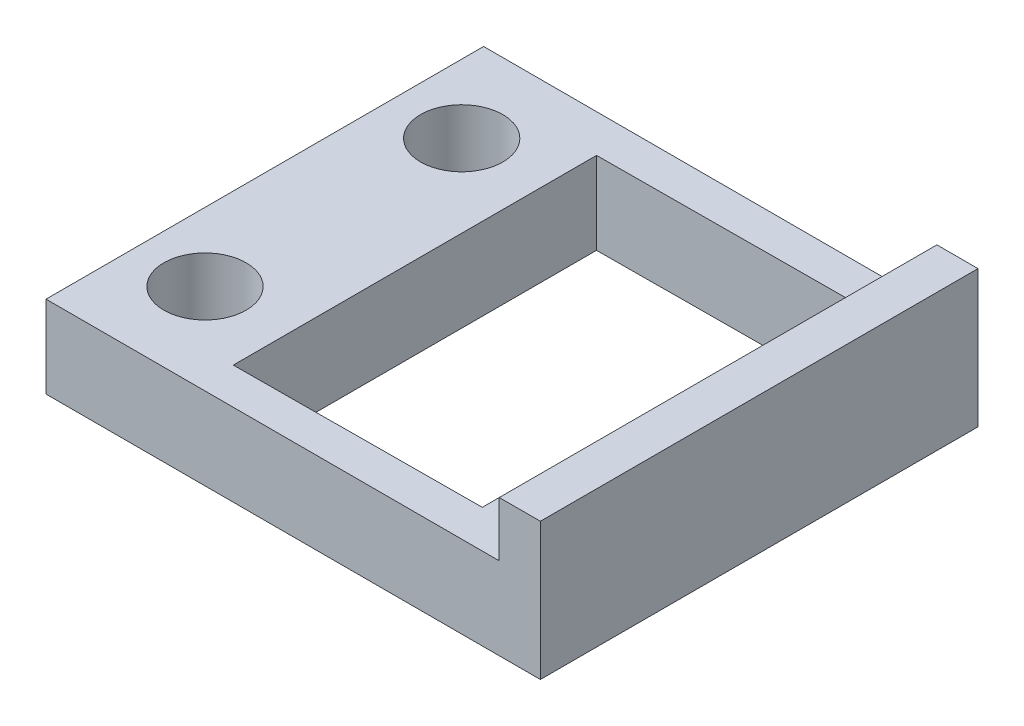
ISO-10303-21;
HEADER;
FILE_DESCRIPTION(('STEP AP214'),'2;1');
FILE_NAME('part.step','',(''),(''),'','','');
FILE_SCHEMA(('AUTOMOTIVE_DESIGN { 1 0 10303 214 1 1 1 1 }'));
ENDSEC;
DATA;
#1=APPLICATION_CONTEXT('core data for automotive mechanical design processes');
#2=APPLICATION_PROTOCOL_DEFINITION('international standard','automotive_design',2000,#1);
#3=PRODUCT_CONTEXT('',#1,'mechanical');
#4=PRODUCT('Part','Part','',(#3));
#5=PRODUCT_RELATED_PRODUCT_CATEGORY('part','',(#4));
#6=PRODUCT_DEFINITION_FORMATION('','',#4);
#7=PRODUCT_DEFINITION_CONTEXT('part definition',#1,'design');
#8=PRODUCT_DEFINITION('design','',#6,#7);
#9=PRODUCT_DEFINITION_SHAPE('','',#8);
#10=(LENGTH_UNIT() NAMED_UNIT(*) SI_UNIT(.MILLI.,.METRE.));
#11=(NAMED_UNIT(*) PLANE_ANGLE_UNIT() SI_UNIT($,.RADIAN.));
#12=(NAMED_UNIT(*) SI_UNIT($,.STERADIAN.) SOLID_ANGLE_UNIT());
#13=UNCERTAINTY_MEASURE_WITH_UNIT(LENGTH_MEASURE(1.E-05),#10,'distance_accuracy_value','');
#14=(GEOMETRIC_REPRESENTATION_CONTEXT(3) GLOBAL_UNCERTAINTY_ASSIGNED_CONTEXT((#13)) GLOBAL_UNIT_ASSIGNED_CONTEXT((#10,
#11,#12)) REPRESENTATION_CONTEXT('',''));
#15=CARTESIAN_POINT('',(0.,0.,0.));
#16=DIRECTION('',(0.,0.,1.));
#17=DIRECTION('',(1.,0.,0.));
#18=AXIS2_PLACEMENT_3D('',#15,#16,#17);
#19=CARTESIAN_POINT('',(0.,3.,0.));
#20=DIRECTION('',(0.,1.,0.));
#21=DIRECTION('',(0.,0.,1.));
#22=AXIS2_PLACEMENT_3D('',#19,#20,#21);
#23=PLANE('',#22);
#24=CARTESIAN_POINT('',(-5.766979,3.,-4.68232118367006));
#25=DIRECTION('',(0.,1.,0.));
#26=DIRECTION('',(0.,0.,1.));
#27=AXIS2_PLACEMENT_3D('',#24,#25,#26);
#28=CIRCLE('',#27,1.5);
#29=CARTESIAN_POINT('',(-5.766979,3.,-3.18232118367006));
#30=VERTEX_POINT('',#29);
#31=EDGE_CURVE('E178',#30,#30,#28,.T.);
#32=ORIENTED_EDGE('',*,*,#31,.F.);
#33=EDGE_LOOP('',(#32));
#34=FACE_BOUND('',#33,.T.);
#35=DIRECTION('',(0.,0.,-1.));
#36=VECTOR('',#35,1.);
#37=CARTESIAN_POINT('',(8.266979,3.,-6.60002018367006));
#38=LINE('',#37,#36);
#39=CARTESIAN_POINT('',(8.266979,3.,7.98228081632994));
#40=VERTEX_POINT('',#39);
#41=CARTESIAN_POINT('',(8.266979,3.,-7.98228081632994));
#42=VERTEX_POINT('',#41);
#43=EDGE_CURVE('E140',#40,#42,#38,.T.);
#44=ORIENTED_EDGE('',*,*,#43,.T.);
#45=DIRECTION('',(-1.,0.,0.));
#46=VECTOR('',#45,1.);
#47=CARTESIAN_POINT('',(8.266979,3.,-7.98228081632994));
#48=LINE('',#47,#46);
#49=CARTESIAN_POINT('',(-8.266979,3.,-7.98228081632994));
#50=VERTEX_POINT('',#49);
#51=EDGE_CURVE('E185',#42,#50,#48,.T.);
#52=ORIENTED_EDGE('',*,*,#51,.T.);
#53=DIRECTION('',(0.,0.,1.));
#54=VECTOR('',#53,1.);
#55=CARTESIAN_POINT('',(-8.266979,3.,-7.98228081632994));
#56=LINE('',#55,#54);
#57=CARTESIAN_POINT('',(-8.266979,3.,7.98228081632994));
#58=VERTEX_POINT('',#57);
#59=EDGE_CURVE('E188',#50,#58,#56,.T.);
#60=ORIENTED_EDGE('',*,*,#59,.T.);
#61=DIRECTION('',(1.,0.,0.));
#62=VECTOR('',#61,1.);
#63=CARTESIAN_POINT('',(-8.266979,3.,7.98228081632994));
#64=LINE('',#63,#62);
#65=EDGE_CURVE('E190',#58,#40,#64,.T.);
#66=ORIENTED_EDGE('',*,*,#65,.T.);
#67=EDGE_LOOP('',(#44,#52,#60,#66));
#68=FACE_BOUND('',#67,.T.);
#69=CARTESIAN_POINT('',(-5.766979,3.,4.68228081632994));
#70=DIRECTION('',(0.,1.,0.));
#71=DIRECTION('',(0.,0.,1.));
#72=AXIS2_PLACEMENT_3D('',#69,#70,#71);
#73=CIRCLE('',#72,1.50000000000002);
#74=CARTESIAN_POINT('',(-5.766979,3.,6.18228081632996));
#75=VERTEX_POINT('',#74);
#76=EDGE_CURVE('E172',#75,#75,#73,.T.);
#77=ORIENTED_EDGE('',*,*,#76,.F.);
#78=EDGE_LOOP('',(#77));
#79=FACE_BOUND('',#78,.T.);
#80=DIRECTION('',(0.,0.,1.));
#81=VECTOR('',#80,1.);
#82=CARTESIAN_POINT('',(-2.766979,3.,6.64997981632989));
#83=LINE('',#82,#81);
#84=CARTESIAN_POINT('',(-2.766979,3.,-6.60002018367012));
#85=VERTEX_POINT('',#84);
#86=CARTESIAN_POINT('',(-2.766979,3.,6.64997981632989));
#87=VERTEX_POINT('',#86);
#88=EDGE_CURVE('E150',#85,#87,#83,.T.);
#89=ORIENTED_EDGE('',*,*,#88,.F.);
#90=DIRECTION('',(-0.999984684051365,0.,0.00553458785202612));
#91=VECTOR('',#90,1.);
#92=CARTESIAN_POINT('',(6.266979,3.,-6.65002018367006));
#93=LINE('',#92,#91);
#94=CARTESIAN_POINT('',(6.266979,3.,-6.65002018367006));
#95=VERTEX_POINT('',#94);
#96=EDGE_CURVE('E148',#95,#85,#93,.T.);
#97=ORIENTED_EDGE('',*,*,#96,.F.);
#98=DIRECTION('',(0.,0.,-1.));
#99=VECTOR('',#98,1.);
#100=CARTESIAN_POINT('',(6.266979,3.,-6.65002018367006));
#101=LINE('',#100,#99);
#102=CARTESIAN_POINT('',(6.266979,3.,6.59997981632994));
#103=VERTEX_POINT('',#102);
#104=EDGE_CURVE('E155',#103,#95,#101,.T.);
#105=ORIENTED_EDGE('',*,*,#104,.F.);
#106=DIRECTION('',(0.999984684051365,0.,-0.00553458785202612));
#107=VECTOR('',#106,1.);
#108=CARTESIAN_POINT('',(6.266979,3.,6.59997981632994));
#109=LINE('',#108,#107);
#110=EDGE_CURVE('E153',#87,#103,#109,.T.);
#111=ORIENTED_EDGE('',*,*,#110,.F.);
#112=EDGE_LOOP('',(#89,#97,#105,#111));
#113=FACE_BOUND('',#112,.T.);
#114=ADVANCED_FACE('F37',(#34,#68,#79,#113),#23,.T.);
#115=CARTESIAN_POINT('',(0.,0.,0.));
#116=DIRECTION('',(0.,1.,0.));
#117=DIRECTION('',(0.,0.,1.));
#118=AXIS2_PLACEMENT_3D('',#115,#116,#117);
#119=PLANE('',#118);
#120=CARTESIAN_POINT('',(-5.766979,0.,4.68228081632994));
#121=DIRECTION('',(0.,1.,0.));
#122=DIRECTION('',(0.,0.,1.));
#123=AXIS2_PLACEMENT_3D('',#120,#121,#122);
#124=CIRCLE('',#123,1.50000000000002);
#125=CARTESIAN_POINT('',(-5.766979,0.,6.18228081632996));
#126=VERTEX_POINT('',#125);
#127=EDGE_CURVE('E171',#126,#126,#124,.T.);
#128=ORIENTED_EDGE('',*,*,#127,.T.);
#129=EDGE_LOOP('',(#128));
#130=FACE_BOUND('',#129,.T.);
#131=CARTESIAN_POINT('',(-5.766979,0.,-4.68232118367006));
#132=DIRECTION('',(0.,1.,0.));
#133=DIRECTION('',(0.,0.,1.));
#134=AXIS2_PLACEMENT_3D('',#131,#132,#133);
#135=CIRCLE('',#134,1.5);
#136=CARTESIAN_POINT('',(-5.766979,0.,-3.18232118367006));
#137=VERTEX_POINT('',#136);
#138=EDGE_CURVE('E175',#137,#137,#135,.T.);
#139=ORIENTED_EDGE('',*,*,#138,.T.);
#140=EDGE_LOOP('',(#139));
#141=FACE_BOUND('',#140,.T.);
#142=DIRECTION('',(-1.,0.,0.));
#143=VECTOR('',#142,1.);
#144=CARTESIAN_POINT('',(-3.266979,0.,-7.98228081632994));
#145=LINE('',#144,#143);
#146=CARTESIAN_POINT('',(9.766979,0.,-7.98228081632994));
#147=VERTEX_POINT('',#146);
#148=CARTESIAN_POINT('',(-8.266979,0.,-7.98228081632994));
#149=VERTEX_POINT('',#148);
#150=EDGE_CURVE('E181',#147,#149,#145,.T.);
#151=ORIENTED_EDGE('',*,*,#150,.F.);
#152=DIRECTION('',(0.,0.,-1.));
#153=VECTOR('',#152,1.);
#154=CARTESIAN_POINT('',(9.766979,0.,7.98228081632994));
#155=LINE('',#154,#153);
#156=CARTESIAN_POINT('',(9.766979,0.,7.98228081632994));
#157=VERTEX_POINT('',#156);
#158=EDGE_CURVE('E136',#157,#147,#155,.T.);
#159=ORIENTED_EDGE('',*,*,#158,.F.);
#160=DIRECTION('',(1.,0.,0.));
#161=VECTOR('',#160,1.);
#162=CARTESIAN_POINT('',(-3.266979,0.,7.98228081632994));
#163=LINE('',#162,#161);
#164=CARTESIAN_POINT('',(-8.266979,0.,7.98228081632994));
#165=VERTEX_POINT('',#164);
#166=EDGE_CURVE('E186',#165,#157,#163,.T.);
#167=ORIENTED_EDGE('',*,*,#166,.F.);
#168=DIRECTION('',(0.,0.,1.));
#169=VECTOR('',#168,1.);
#170=CARTESIAN_POINT('',(-8.266979,0.,-7.98228081632994));
#171=LINE('',#170,#169);
#172=EDGE_CURVE('E193',#149,#165,#171,.T.);
#173=ORIENTED_EDGE('',*,*,#172,.F.);
#174=EDGE_LOOP('',(#151,#159,#167,#173));
#175=FACE_BOUND('',#174,.T.);
#176=DIRECTION('',(-0.999984684051365,0.,0.00553458785202612));
#177=VECTOR('',#176,1.);
#178=CARTESIAN_POINT('',(6.266979,0.,-6.65002018367006));
#179=LINE('',#178,#177);
#180=CARTESIAN_POINT('',(6.266979,0.,-6.65002018367006));
#181=VERTEX_POINT('',#180);
#182=CARTESIAN_POINT('',(-2.766979,0.,-6.60002018367012));
#183=VERTEX_POINT('',#182);
#184=EDGE_CURVE('E60',#181,#183,#179,.T.);
#185=ORIENTED_EDGE('',*,*,#184,.T.);
#186=DIRECTION('',(0.,0.,1.));
#187=VECTOR('',#186,1.);
#188=CARTESIAN_POINT('',(-2.766979,0.,6.64997981632989));
#189=LINE('',#188,#187);
#190=CARTESIAN_POINT('',(-2.766979,0.,6.64997981632989));
#191=VERTEX_POINT('',#190);
#192=EDGE_CURVE('E142',#183,#191,#189,.T.);
#193=ORIENTED_EDGE('',*,*,#192,.T.);
#194=DIRECTION('',(0.999984684051365,0.,-0.00553458785202612));
#195=VECTOR('',#194,1.);
#196=CARTESIAN_POINT('',(6.266979,0.,6.59997981632994));
#197=LINE('',#196,#195);
#198=CARTESIAN_POINT('',(6.266979,0.,6.59997981632994));
#199=VERTEX_POINT('',#198);
#200=EDGE_CURVE('E160',#191,#199,#197,.T.);
#201=ORIENTED_EDGE('',*,*,#200,.T.);
#202=DIRECTION('',(0.,0.,-1.));
#203=VECTOR('',#202,1.);
#204=CARTESIAN_POINT('',(6.266979,0.,-6.65002018367006));
#205=LINE('',#204,#203);
#206=EDGE_CURVE('E151',#199,#181,#205,.T.);
#207=ORIENTED_EDGE('',*,*,#206,.T.);
#208=EDGE_LOOP('',(#185,#193,#201,#207));
#209=FACE_BOUND('',#208,.T.);
#210=ADVANCED_FACE('F204',(#130,#141,#175,#209),#119,.F.);
#211=CARTESIAN_POINT('',(-3.266979,3.,-7.98228081632994));
#212=DIRECTION('',(0.,0.,1.));
#213=DIRECTION('',(1.,0.,0.));
#214=AXIS2_PLACEMENT_3D('',#211,#212,#213);
#215=PLANE('',#214);
#216=ORIENTED_EDGE('',*,*,#150,.T.);
#217=DIRECTION('',(0.,-1.,0.));
#218=VECTOR('',#217,1.);
#219=CARTESIAN_POINT('',(-8.266979,3.,-7.98228081632994));
#220=LINE('',#219,#218);
#221=EDGE_CURVE('E11',#50,#149,#220,.T.);
#222=ORIENTED_EDGE('',*,*,#221,.F.);
#223=ORIENTED_EDGE('',*,*,#51,.F.);
#224=DIRECTION('',(0.,-1.,0.));
#225=VECTOR('',#224,1.);
#226=CARTESIAN_POINT('',(8.266979,5.,-7.98228081632994));
#227=LINE('',#226,#225);
#228=CARTESIAN_POINT('',(8.266979,5.,-7.98228081632994));
#229=VERTEX_POINT('',#228);
#230=EDGE_CURVE('E215',#229,#42,#227,.T.);
#231=ORIENTED_EDGE('',*,*,#230,.F.);
#232=DIRECTION('',(-1.,0.,0.));
#233=VECTOR('',#232,1.);
#234=CARTESIAN_POINT('',(9.766979,5.,-7.98228081632994));
#235=LINE('',#234,#233);
#236=CARTESIAN_POINT('',(9.766979,5.,-7.98228081632994));
#237=VERTEX_POINT('',#236);
#238=EDGE_CURVE('E133',#237,#229,#235,.T.);
#239=ORIENTED_EDGE('',*,*,#238,.F.);
#240=DIRECTION('',(0.,-1.,0.));
#241=VECTOR('',#240,1.);
#242=CARTESIAN_POINT('',(9.766979,5.,-7.98228081632994));
#243=LINE('',#242,#241);
#244=EDGE_CURVE('E144',#237,#147,#243,.T.);
#245=ORIENTED_EDGE('',*,*,#244,.T.);
#246=EDGE_LOOP('',(#216,#222,#223,#231,#239,#245));
#247=FACE_BOUND('',#246,.T.);
#248=ADVANCED_FACE('F39',(#247),#215,.F.);
#249=CARTESIAN_POINT('',(-8.266979,3.,-7.98228081632994));
#250=DIRECTION('',(1.,0.,0.));
#251=DIRECTION('',(0.,0.,-1.));
#252=AXIS2_PLACEMENT_3D('',#249,#250,#251);
#253=PLANE('',#252);
#254=ORIENTED_EDGE('',*,*,#172,.T.);
#255=DIRECTION('',(0.,-1.,0.));
#256=VECTOR('',#255,1.);
#257=CARTESIAN_POINT('',(-8.266979,3.,7.98228081632994));
#258=LINE('',#257,#256);
#259=EDGE_CURVE('E45',#58,#165,#258,.T.);
#260=ORIENTED_EDGE('',*,*,#259,.F.);
#261=ORIENTED_EDGE('',*,*,#59,.F.);
#262=ORIENTED_EDGE('',*,*,#221,.T.);
#263=EDGE_LOOP('',(#254,#260,#261,#262));
#264=FACE_BOUND('',#263,.T.);
#265=ADVANCED_FACE('F200',(#264),#253,.F.);
#266=CARTESIAN_POINT('',(-3.266979,3.,7.98228081632994));
#267=DIRECTION('',(0.,0.,-1.));
#268=DIRECTION('',(-1.,0.,0.));
#269=AXIS2_PLACEMENT_3D('',#266,#267,#268);
#270=PLANE('',#269);
#271=ORIENTED_EDGE('',*,*,#166,.T.);
#272=DIRECTION('',(0.,-1.,0.));
#273=VECTOR('',#272,1.);
#274=CARTESIAN_POINT('',(9.766979,5.,7.98228081632994));
#275=LINE('',#274,#273);
#276=CARTESIAN_POINT('',(9.766979,5.,7.98228081632994));
#277=VERTEX_POINT('',#276);
#278=EDGE_CURVE('E124',#277,#157,#275,.T.);
#279=ORIENTED_EDGE('',*,*,#278,.F.);
#280=DIRECTION('',(1.,0.,0.));
#281=VECTOR('',#280,1.);
#282=CARTESIAN_POINT('',(8.266979,5.,7.98228081632994));
#283=LINE('',#282,#281);
#284=CARTESIAN_POINT('',(8.266979,5.,7.98228081632994));
#285=VERTEX_POINT('',#284);
#286=EDGE_CURVE('E116',#285,#277,#283,.T.);
#287=ORIENTED_EDGE('',*,*,#286,.F.);
#288=DIRECTION('',(0.,-1.,0.));
#289=VECTOR('',#288,1.);
#290=CARTESIAN_POINT('',(8.266979,5.,7.98228081632994));
#291=LINE('',#290,#289);
#292=EDGE_CURVE('E121',#285,#40,#291,.T.);
#293=ORIENTED_EDGE('',*,*,#292,.T.);
#294=ORIENTED_EDGE('',*,*,#65,.F.);
#295=ORIENTED_EDGE('',*,*,#259,.T.);
#296=EDGE_LOOP('',(#271,#279,#287,#293,#294,#295));
#297=FACE_BOUND('',#296,.T.);
#298=ADVANCED_FACE('F118',(#297),#270,.F.);
#299=CARTESIAN_POINT('',(-5.766979,3.,-4.68232118367006));
#300=DIRECTION('',(0.,-1.,0.));
#301=DIRECTION('',(0.,0.,-1.));
#302=AXIS2_PLACEMENT_3D('',#299,#300,#301);
#303=CYLINDRICAL_SURFACE('',#302,1.5);
#304=ORIENTED_EDGE('',*,*,#31,.T.);
#305=EDGE_LOOP('',(#304));
#306=FACE_BOUND('',#305,.T.);
#307=ORIENTED_EDGE('',*,*,#138,.F.);
#308=EDGE_LOOP('',(#307));
#309=FACE_BOUND('',#308,.T.);
#310=ADVANCED_FACE('F238',(#306,#309),#303,.F.);
#311=CARTESIAN_POINT('',(-5.766979,3.,4.68228081632994));
#312=DIRECTION('',(0.,-1.,0.));
#313=DIRECTION('',(0.,0.,-1.));
#314=AXIS2_PLACEMENT_3D('',#311,#312,#313);
#315=CYLINDRICAL_SURFACE('',#314,1.50000000000002);
#316=ORIENTED_EDGE('',*,*,#76,.T.);
#317=EDGE_LOOP('',(#316));
#318=FACE_BOUND('',#317,.T.);
#319=ORIENTED_EDGE('',*,*,#127,.F.);
#320=EDGE_LOOP('',(#319));
#321=FACE_BOUND('',#320,.T.);
#322=ADVANCED_FACE('F300',(#318,#321),#315,.F.);
#323=CARTESIAN_POINT('',(6.266979,3.,-6.65002018367006));
#324=DIRECTION('',(0.00553458785202612,0.,0.999984684051365));
#325=DIRECTION('',(0.999984684051365,0.,-0.00553458785202612));
#326=AXIS2_PLACEMENT_3D('',#323,#324,#325);
#327=PLANE('',#326);
#328=ORIENTED_EDGE('',*,*,#184,.F.);
#329=DIRECTION('',(0.,-1.,0.));
#330=VECTOR('',#329,1.);
#331=CARTESIAN_POINT('',(6.266979,3.,-6.65002018367006));
#332=LINE('',#331,#330);
#333=EDGE_CURVE('E156',#95,#181,#332,.T.);
#334=ORIENTED_EDGE('',*,*,#333,.F.);
#335=ORIENTED_EDGE('',*,*,#96,.T.);
#336=DIRECTION('',(0.,-1.,0.));
#337=VECTOR('',#336,1.);
#338=CARTESIAN_POINT('',(-2.766979,3.,-6.60002018367012));
#339=LINE('',#338,#337);
#340=EDGE_CURVE('E169',#85,#183,#339,.T.);
#341=ORIENTED_EDGE('',*,*,#340,.T.);
#342=EDGE_LOOP('',(#328,#334,#335,#341));
#343=FACE_BOUND('',#342,.T.);
#344=ADVANCED_FACE('F289',(#343),#327,.T.);
#345=CARTESIAN_POINT('',(-2.766979,3.,6.64997981632989));
#346=DIRECTION('',(1.,0.,0.));
#347=DIRECTION('',(0.,0.,-1.));
#348=AXIS2_PLACEMENT_3D('',#345,#346,#347);
#349=PLANE('',#348);
#350=ORIENTED_EDGE('',*,*,#192,.F.);
#351=ORIENTED_EDGE('',*,*,#340,.F.);
#352=ORIENTED_EDGE('',*,*,#88,.T.);
#353=DIRECTION('',(0.,-1.,0.));
#354=VECTOR('',#353,1.);
#355=CARTESIAN_POINT('',(-2.766979,3.,6.64997981632989));
#356=LINE('',#355,#354);
#357=EDGE_CURVE('E167',#87,#191,#356,.T.);
#358=ORIENTED_EDGE('',*,*,#357,.T.);
#359=EDGE_LOOP('',(#350,#351,#352,#358));
#360=FACE_BOUND('',#359,.T.);
#361=ADVANCED_FACE('F278',(#360),#349,.T.);
#362=CARTESIAN_POINT('',(6.266979,3.,6.59997981632994));
#363=DIRECTION('',(-0.00553458785202612,0.,-0.999984684051365));
#364=DIRECTION('',(-0.999984684051365,0.,0.00553458785202612));
#365=AXIS2_PLACEMENT_3D('',#362,#363,#364);
#366=PLANE('',#365);
#367=ORIENTED_EDGE('',*,*,#200,.F.);
#368=ORIENTED_EDGE('',*,*,#357,.F.);
#369=ORIENTED_EDGE('',*,*,#110,.T.);
#370=DIRECTION('',(0.,-1.,0.));
#371=VECTOR('',#370,1.);
#372=CARTESIAN_POINT('',(6.266979,3.,6.59997981632994));
#373=LINE('',#372,#371);
#374=EDGE_CURVE('E52',#103,#199,#373,.T.);
#375=ORIENTED_EDGE('',*,*,#374,.T.);
#376=EDGE_LOOP('',(#367,#368,#369,#375));
#377=FACE_BOUND('',#376,.T.);
#378=ADVANCED_FACE('F268',(#377),#366,.T.);
#379=CARTESIAN_POINT('',(6.266979,3.,-6.65002018367006));
#380=DIRECTION('',(-1.,0.,0.));
#381=DIRECTION('',(0.,0.,1.));
#382=AXIS2_PLACEMENT_3D('',#379,#380,#381);
#383=PLANE('',#382);
#384=ORIENTED_EDGE('',*,*,#206,.F.);
#385=ORIENTED_EDGE('',*,*,#374,.F.);
#386=ORIENTED_EDGE('',*,*,#104,.T.);
#387=ORIENTED_EDGE('',*,*,#333,.T.);
#388=EDGE_LOOP('',(#384,#385,#386,#387));
#389=FACE_BOUND('',#388,.T.);
#390=ADVANCED_FACE('F225',(#389),#383,.T.);
#391=CARTESIAN_POINT('',(8.266979,5.,-7.98228081632994));
#392=DIRECTION('',(1.,0.,0.));
#393=DIRECTION('',(0.,0.,-1.));
#394=AXIS2_PLACEMENT_3D('',#391,#392,#393);
#395=PLANE('',#394);
#396=ORIENTED_EDGE('',*,*,#43,.F.);
#397=ORIENTED_EDGE('',*,*,#292,.F.);
#398=DIRECTION('',(0.,0.,1.));
#399=VECTOR('',#398,1.);
#400=CARTESIAN_POINT('',(8.266979,5.,-7.98228081632994));
#401=LINE('',#400,#399);
#402=EDGE_CURVE('E128',#229,#285,#401,.T.);
#403=ORIENTED_EDGE('',*,*,#402,.F.);
#404=ORIENTED_EDGE('',*,*,#230,.T.);
#405=EDGE_LOOP('',(#396,#397,#403,#404));
#406=FACE_BOUND('',#405,.T.);
#407=ADVANCED_FACE('F138',(#406),#395,.F.);
#408=CARTESIAN_POINT('',(9.766979,5.,7.98228081632994));
#409=DIRECTION('',(-1.,0.,0.));
#410=DIRECTION('',(0.,0.,1.));
#411=AXIS2_PLACEMENT_3D('',#408,#409,#410);
#412=PLANE('',#411);
#413=ORIENTED_EDGE('',*,*,#158,.T.);
#414=ORIENTED_EDGE('',*,*,#244,.F.);
#415=DIRECTION('',(0.,0.,-1.));
#416=VECTOR('',#415,1.);
#417=CARTESIAN_POINT('',(9.766979,5.,7.98228081632994));
#418=LINE('',#417,#416);
#419=EDGE_CURVE('E127',#277,#237,#418,.T.);
#420=ORIENTED_EDGE('',*,*,#419,.F.);
#421=ORIENTED_EDGE('',*,*,#278,.T.);
#422=EDGE_LOOP('',(#413,#414,#420,#421));
#423=FACE_BOUND('',#422,.T.);
#424=ADVANCED_FACE('F217',(#423),#412,.F.);
#425=CARTESIAN_POINT('',(0.,5.,0.));
#426=DIRECTION('',(0.,1.,0.));
#427=DIRECTION('',(0.,0.,1.));
#428=AXIS2_PLACEMENT_3D('',#425,#426,#427);
#429=PLANE('',#428);
#430=ORIENTED_EDGE('',*,*,#402,.T.);
#431=ORIENTED_EDGE('',*,*,#286,.T.);
#432=ORIENTED_EDGE('',*,*,#419,.T.);
#433=ORIENTED_EDGE('',*,*,#238,.T.);
#434=EDGE_LOOP('',(#430,#431,#432,#433));
#435=FACE_BOUND('',#434,.T.);
#436=ADVANCED_FACE('F131',(#435),#429,.T.);
#437=CLOSED_SHELL('',(#114,#210,#248,#265,#298,#310,#322,#344,#361,#378,#390,#407,#424,#436));
#438=MANIFOLD_SOLID_BREP('B2',#437);
#439=ADVANCED_BREP_SHAPE_REPRESENTATION('',(#18,#438),#14);
#440=SHAPE_DEFINITION_REPRESENTATION(#9,#439);
ENDSEC;
END-ISO-10303-21;
